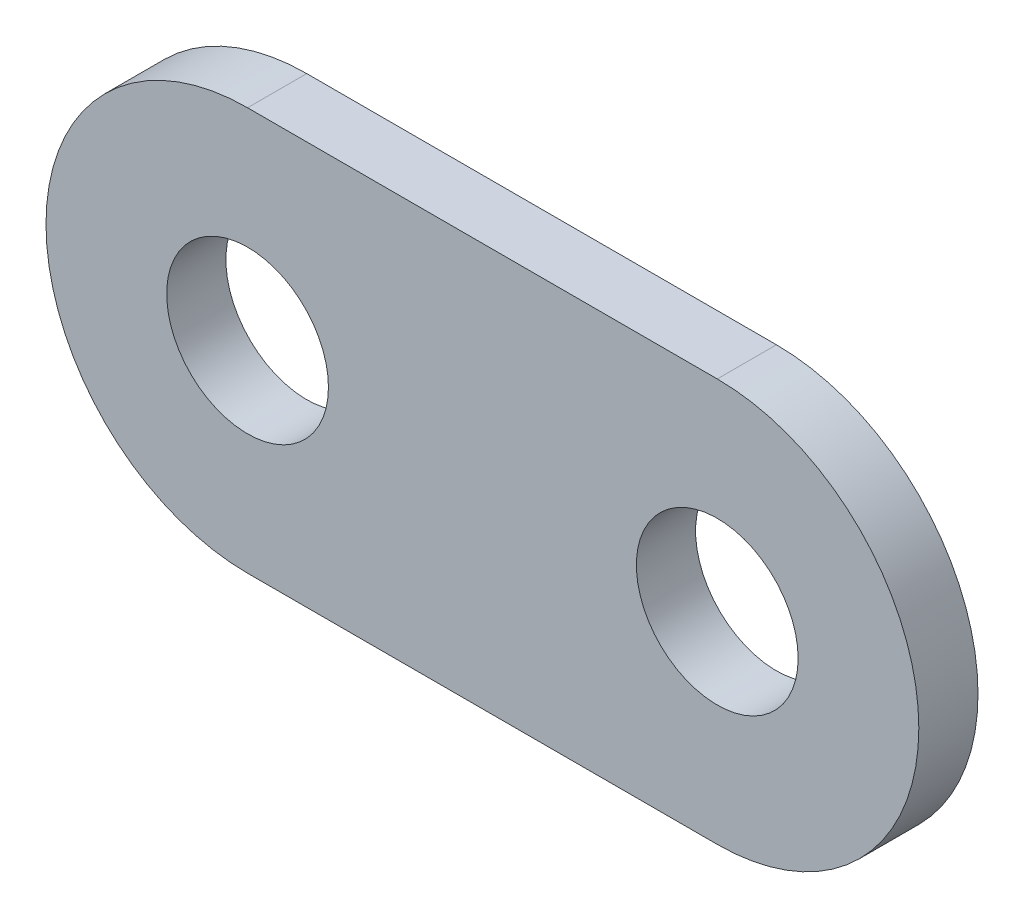
ISO-10303-21;
HEADER;
FILE_DESCRIPTION(('STEP AP214'),'2;1');
FILE_NAME('part.step','',(''),(''),'','','');
FILE_SCHEMA(('AUTOMOTIVE_DESIGN { 1 0 10303 214 1 1 1 1 }'));
ENDSEC;
DATA;
#1=APPLICATION_CONTEXT('core data for automotive mechanical design processes');
#2=APPLICATION_PROTOCOL_DEFINITION('international standard','automotive_design',2000,#1);
#3=PRODUCT_CONTEXT('',#1,'mechanical');
#4=PRODUCT('Part','Part','',(#3));
#5=PRODUCT_RELATED_PRODUCT_CATEGORY('part','',(#4));
#6=PRODUCT_DEFINITION_FORMATION('','',#4);
#7=PRODUCT_DEFINITION_CONTEXT('part definition',#1,'design');
#8=PRODUCT_DEFINITION('design','',#6,#7);
#9=PRODUCT_DEFINITION_SHAPE('','',#8);
#10=(LENGTH_UNIT() NAMED_UNIT(*) SI_UNIT(.MILLI.,.METRE.));
#11=(NAMED_UNIT(*) PLANE_ANGLE_UNIT() SI_UNIT($,.RADIAN.));
#12=(NAMED_UNIT(*) SI_UNIT($,.STERADIAN.) SOLID_ANGLE_UNIT());
#13=UNCERTAINTY_MEASURE_WITH_UNIT(LENGTH_MEASURE(1.E-05),#10,'distance_accuracy_value','');
#14=(GEOMETRIC_REPRESENTATION_CONTEXT(3) GLOBAL_UNCERTAINTY_ASSIGNED_CONTEXT((#13)) GLOBAL_UNIT_ASSIGNED_CONTEXT((#10,
#11,#12)) REPRESENTATION_CONTEXT('',''));
#15=CARTESIAN_POINT('',(0.,0.,0.));
#16=DIRECTION('',(0.,0.,1.));
#17=DIRECTION('',(1.,0.,0.));
#18=AXIS2_PLACEMENT_3D('',#15,#16,#17);
#19=CARTESIAN_POINT('',(28.575,0.,4.33));
#20=DIRECTION('',(0.,0.,1.));
#21=DIRECTION('',(1.,0.,0.));
#22=AXIS2_PLACEMENT_3D('',#19,#20,#21);
#23=PLANE('',#22);
#24=CARTESIAN_POINT('',(28.575,0.,4.33));
#25=DIRECTION('',(0.,0.,1.));
#26=DIRECTION('',(1.,0.,0.));
#27=AXIS2_PLACEMENT_3D('',#24,#25,#26);
#28=CIRCLE('',#27,1.64);
#29=CARTESIAN_POINT('',(30.215,0.,4.33));
#30=VERTEX_POINT('',#29);
#31=EDGE_CURVE('E76',#30,#30,#28,.T.);
#32=ORIENTED_EDGE('',*,*,#31,.T.);
#33=EDGE_LOOP('',(#32));
#34=FACE_BOUND('',#33,.T.);
#35=CARTESIAN_POINT('',(38.1,0.,4.33));
#36=DIRECTION('',(0.,0.,1.));
#37=DIRECTION('',(1.,0.,0.));
#38=AXIS2_PLACEMENT_3D('',#35,#36,#37);
#39=CIRCLE('',#38,1.64);
#40=CARTESIAN_POINT('',(39.74,0.,4.33));
#41=VERTEX_POINT('',#40);
#42=EDGE_CURVE('E89',#41,#41,#39,.T.);
#43=ORIENTED_EDGE('',*,*,#42,.T.);
#44=EDGE_LOOP('',(#43));
#45=FACE_BOUND('',#44,.T.);
#46=DIRECTION('',(-1.,0.,0.));
#47=VECTOR('',#46,1.);
#48=CARTESIAN_POINT('',(38.1,4.0875,4.33));
#49=LINE('',#48,#47);
#50=CARTESIAN_POINT('',(38.1,4.0875,4.33));
#51=VERTEX_POINT('',#50);
#52=CARTESIAN_POINT('',(28.575,4.0875,4.33));
#53=VERTEX_POINT('',#52);
#54=EDGE_CURVE('E103',#51,#53,#49,.T.);
#55=ORIENTED_EDGE('',*,*,#54,.F.);
#56=CARTESIAN_POINT('',(38.1,0.,4.33));
#57=DIRECTION('',(0.,0.,1.));
#58=DIRECTION('',(1.,0.,0.));
#59=AXIS2_PLACEMENT_3D('',#56,#57,#58);
#60=CIRCLE('',#59,4.0875);
#61=CARTESIAN_POINT('',(38.1,-4.0875,4.33));
#62=VERTEX_POINT('',#61);
#63=EDGE_CURVE('E113',#62,#51,#60,.T.);
#64=ORIENTED_EDGE('',*,*,#63,.F.);
#65=DIRECTION('',(1.,0.,0.));
#66=VECTOR('',#65,1.);
#67=CARTESIAN_POINT('',(28.575,-4.0875,4.33));
#68=LINE('',#67,#66);
#69=CARTESIAN_POINT('',(28.575,-4.0875,4.33));
#70=VERTEX_POINT('',#69);
#71=EDGE_CURVE('E27',#70,#62,#68,.T.);
#72=ORIENTED_EDGE('',*,*,#71,.F.);
#73=CARTESIAN_POINT('',(28.575,0.,4.33));
#74=DIRECTION('',(0.,0.,1.));
#75=DIRECTION('',(1.,0.,0.));
#76=AXIS2_PLACEMENT_3D('',#73,#74,#75);
#77=CIRCLE('',#76,4.0875);
#78=EDGE_CURVE('E93',#53,#70,#77,.T.);
#79=ORIENTED_EDGE('',*,*,#78,.F.);
#80=EDGE_LOOP('',(#55,#64,#72,#79));
#81=FACE_BOUND('',#80,.T.);
#82=ADVANCED_FACE('F16',(#34,#45,#81),#23,.F.);
#83=CARTESIAN_POINT('',(28.575,0.,5.53));
#84=DIRECTION('',(0.,0.,1.));
#85=DIRECTION('',(1.,0.,0.));
#86=AXIS2_PLACEMENT_3D('',#83,#84,#85);
#87=PLANE('',#86);
#88=CARTESIAN_POINT('',(28.575,0.,5.53));
#89=DIRECTION('',(0.,0.,1.));
#90=DIRECTION('',(1.,0.,0.));
#91=AXIS2_PLACEMENT_3D('',#88,#89,#90);
#92=CIRCLE('',#91,1.64);
#93=CARTESIAN_POINT('',(30.215,0.,5.53));
#94=VERTEX_POINT('',#93);
#95=EDGE_CURVE('E81',#94,#94,#92,.T.);
#96=ORIENTED_EDGE('',*,*,#95,.F.);
#97=EDGE_LOOP('',(#96));
#98=FACE_BOUND('',#97,.T.);
#99=CARTESIAN_POINT('',(38.1,0.,5.53));
#100=DIRECTION('',(0.,0.,1.));
#101=DIRECTION('',(1.,0.,0.));
#102=AXIS2_PLACEMENT_3D('',#99,#100,#101);
#103=CIRCLE('',#102,1.64);
#104=CARTESIAN_POINT('',(39.74,0.,5.53));
#105=VERTEX_POINT('',#104);
#106=EDGE_CURVE('E107',#105,#105,#103,.T.);
#107=ORIENTED_EDGE('',*,*,#106,.F.);
#108=EDGE_LOOP('',(#107));
#109=FACE_BOUND('',#108,.T.);
#110=DIRECTION('',(-1.,0.,0.));
#111=VECTOR('',#110,1.);
#112=CARTESIAN_POINT('',(38.1,4.0875,5.53));
#113=LINE('',#112,#111);
#114=CARTESIAN_POINT('',(38.1,4.0875,5.53));
#115=VERTEX_POINT('',#114);
#116=CARTESIAN_POINT('',(28.575,4.0875,5.53));
#117=VERTEX_POINT('',#116);
#118=EDGE_CURVE('E41',#115,#117,#113,.T.);
#119=ORIENTED_EDGE('',*,*,#118,.T.);
#120=CARTESIAN_POINT('',(28.575,0.,5.53));
#121=DIRECTION('',(0.,0.,1.));
#122=DIRECTION('',(1.,0.,0.));
#123=AXIS2_PLACEMENT_3D('',#120,#121,#122);
#124=CIRCLE('',#123,4.0875);
#125=CARTESIAN_POINT('',(28.575,-4.0875,5.53));
#126=VERTEX_POINT('',#125);
#127=EDGE_CURVE('E97',#117,#126,#124,.T.);
#128=ORIENTED_EDGE('',*,*,#127,.T.);
#129=DIRECTION('',(1.,0.,0.));
#130=VECTOR('',#129,1.);
#131=CARTESIAN_POINT('',(28.575,-4.0875,5.53));
#132=LINE('',#131,#130);
#133=CARTESIAN_POINT('',(38.1,-4.0875,5.53));
#134=VERTEX_POINT('',#133);
#135=EDGE_CURVE('E11',#126,#134,#132,.T.);
#136=ORIENTED_EDGE('',*,*,#135,.T.);
#137=CARTESIAN_POINT('',(38.1,0.,5.53));
#138=DIRECTION('',(0.,0.,1.));
#139=DIRECTION('',(1.,0.,0.));
#140=AXIS2_PLACEMENT_3D('',#137,#138,#139);
#141=CIRCLE('',#140,4.0875);
#142=EDGE_CURVE('E80',#134,#115,#141,.T.);
#143=ORIENTED_EDGE('',*,*,#142,.T.);
#144=EDGE_LOOP('',(#119,#128,#136,#143));
#145=FACE_BOUND('',#144,.T.);
#146=ADVANCED_FACE('F191',(#98,#109,#145),#87,.T.);
#147=CARTESIAN_POINT('',(28.575,-4.0875,5.53));
#148=DIRECTION('',(0.,1.,0.));
#149=DIRECTION('',(1.,0.,0.));
#150=AXIS2_PLACEMENT_3D('',#147,#148,#149);
#151=PLANE('',#150);
#152=ORIENTED_EDGE('',*,*,#71,.T.);
#153=DIRECTION('',(0.,0.,-1.));
#154=VECTOR('',#153,1.);
#155=CARTESIAN_POINT('',(38.1,-4.0875,5.53));
#156=LINE('',#155,#154);
#157=EDGE_CURVE('E86',#134,#62,#156,.T.);
#158=ORIENTED_EDGE('',*,*,#157,.F.);
#159=ORIENTED_EDGE('',*,*,#135,.F.);
#160=DIRECTION('',(0.,0.,-1.));
#161=VECTOR('',#160,1.);
#162=CARTESIAN_POINT('',(28.575,-4.0875,5.53));
#163=LINE('',#162,#161);
#164=EDGE_CURVE('E20',#126,#70,#163,.T.);
#165=ORIENTED_EDGE('',*,*,#164,.T.);
#166=EDGE_LOOP('',(#152,#158,#159,#165));
#167=FACE_BOUND('',#166,.T.);
#168=ADVANCED_FACE('F18',(#167),#151,.F.);
#169=CARTESIAN_POINT('',(38.1,4.0875,5.53));
#170=DIRECTION('',(0.,-1.,0.));
#171=DIRECTION('',(0.,0.,-1.));
#172=AXIS2_PLACEMENT_3D('',#169,#170,#171);
#173=PLANE('',#172);
#174=ORIENTED_EDGE('',*,*,#54,.T.);
#175=DIRECTION('',(0.,0.,-1.));
#176=VECTOR('',#175,1.);
#177=CARTESIAN_POINT('',(28.575,4.0875,5.53));
#178=LINE('',#177,#176);
#179=EDGE_CURVE('E100',#117,#53,#178,.T.);
#180=ORIENTED_EDGE('',*,*,#179,.F.);
#181=ORIENTED_EDGE('',*,*,#118,.F.);
#182=DIRECTION('',(0.,0.,-1.));
#183=VECTOR('',#182,1.);
#184=CARTESIAN_POINT('',(38.1,4.0875,5.53));
#185=LINE('',#184,#183);
#186=EDGE_CURVE('E96',#115,#51,#185,.T.);
#187=ORIENTED_EDGE('',*,*,#186,.T.);
#188=EDGE_LOOP('',(#174,#180,#181,#187));
#189=FACE_BOUND('',#188,.T.);
#190=ADVANCED_FACE('F173',(#189),#173,.F.);
#191=CARTESIAN_POINT('',(28.575,0.,5.53));
#192=DIRECTION('',(0.,0.,1.));
#193=DIRECTION('',(-1.,0.,0.));
#194=AXIS2_PLACEMENT_3D('',#191,#192,#193);
#195=CYLINDRICAL_SURFACE('',#194,4.0875);
#196=ORIENTED_EDGE('',*,*,#78,.T.);
#197=ORIENTED_EDGE('',*,*,#164,.F.);
#198=ORIENTED_EDGE('',*,*,#127,.F.);
#199=ORIENTED_EDGE('',*,*,#179,.T.);
#200=EDGE_LOOP('',(#196,#197,#198,#199));
#201=FACE_BOUND('',#200,.T.);
#202=ADVANCED_FACE('F142',(#201),#195,.T.);
#203=CARTESIAN_POINT('',(38.1,0.,5.53));
#204=DIRECTION('',(0.,0.,1.));
#205=DIRECTION('',(-1.,0.,0.));
#206=AXIS2_PLACEMENT_3D('',#203,#204,#205);
#207=CYLINDRICAL_SURFACE('',#206,4.0875);
#208=ORIENTED_EDGE('',*,*,#142,.F.);
#209=ORIENTED_EDGE('',*,*,#157,.T.);
#210=ORIENTED_EDGE('',*,*,#63,.T.);
#211=ORIENTED_EDGE('',*,*,#186,.F.);
#212=EDGE_LOOP('',(#208,#209,#210,#211));
#213=FACE_BOUND('',#212,.T.);
#214=ADVANCED_FACE('F161',(#213),#207,.T.);
#215=CARTESIAN_POINT('',(28.575,0.,5.53));
#216=DIRECTION('',(0.,0.,1.));
#217=DIRECTION('',(-1.,0.,0.));
#218=AXIS2_PLACEMENT_3D('',#215,#216,#217);
#219=CYLINDRICAL_SURFACE('',#218,1.64);
#220=ORIENTED_EDGE('',*,*,#31,.F.);
#221=EDGE_LOOP('',(#220));
#222=FACE_BOUND('',#221,.T.);
#223=ORIENTED_EDGE('',*,*,#95,.T.);
#224=EDGE_LOOP('',(#223));
#225=FACE_BOUND('',#224,.T.);
#226=ADVANCED_FACE('F155',(#222,#225),#219,.F.);
#227=CARTESIAN_POINT('',(38.1,0.,5.53));
#228=DIRECTION('',(0.,0.,1.));
#229=DIRECTION('',(-1.,0.,0.));
#230=AXIS2_PLACEMENT_3D('',#227,#228,#229);
#231=CYLINDRICAL_SURFACE('',#230,1.64);
#232=ORIENTED_EDGE('',*,*,#42,.F.);
#233=EDGE_LOOP('',(#232));
#234=FACE_BOUND('',#233,.T.);
#235=ORIENTED_EDGE('',*,*,#106,.T.);
#236=EDGE_LOOP('',(#235));
#237=FACE_BOUND('',#236,.T.);
#238=ADVANCED_FACE('F160',(#234,#237),#231,.F.);
#239=CLOSED_SHELL('',(#82,#146,#168,#190,#202,#214,#226,#238));
#240=MANIFOLD_SOLID_BREP('B1',#239);
#241=ADVANCED_BREP_SHAPE_REPRESENTATION('',(#18,#240),#14);
#242=SHAPE_DEFINITION_REPRESENTATION(#9,#241);
ENDSEC;
END-ISO-10303-21;
